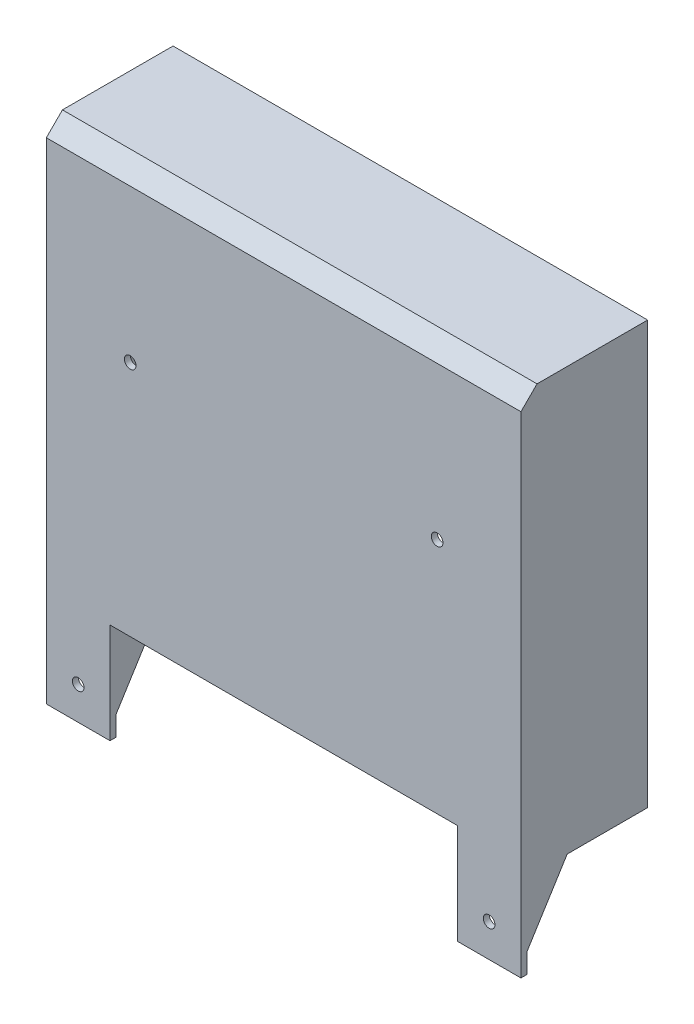
ISO-10303-21;
HEADER;
FILE_DESCRIPTION(('STEP AP214'),'2;1');
FILE_NAME('part.step','',(''),(''),'','','');
FILE_SCHEMA(('AUTOMOTIVE_DESIGN { 1 0 10303 214 1 1 1 1 }'));
ENDSEC;
DATA;
#1=APPLICATION_CONTEXT('core data for automotive mechanical design processes');
#2=APPLICATION_PROTOCOL_DEFINITION('international standard','automotive_design',2000,#1);
#3=PRODUCT_CONTEXT('',#1,'mechanical');
#4=PRODUCT('Part','Part','',(#3));
#5=PRODUCT_RELATED_PRODUCT_CATEGORY('part','',(#4));
#6=PRODUCT_DEFINITION_FORMATION('','',#4);
#7=PRODUCT_DEFINITION_CONTEXT('part definition',#1,'design');
#8=PRODUCT_DEFINITION('design','',#6,#7);
#9=PRODUCT_DEFINITION_SHAPE('','',#8);
#10=(LENGTH_UNIT() NAMED_UNIT(*) SI_UNIT(.MILLI.,.METRE.));
#11=(NAMED_UNIT(*) PLANE_ANGLE_UNIT() SI_UNIT($,.RADIAN.));
#12=(NAMED_UNIT(*) SI_UNIT($,.STERADIAN.) SOLID_ANGLE_UNIT());
#13=UNCERTAINTY_MEASURE_WITH_UNIT(LENGTH_MEASURE(1.E-05),#10,'distance_accuracy_value','');
#14=(GEOMETRIC_REPRESENTATION_CONTEXT(3) GLOBAL_UNCERTAINTY_ASSIGNED_CONTEXT((#13)) GLOBAL_UNIT_ASSIGNED_CONTEXT((#10,
#11,#12)) REPRESENTATION_CONTEXT('',''));
#15=CARTESIAN_POINT('',(0.,0.,0.));
#16=DIRECTION('',(0.,0.,1.));
#17=DIRECTION('',(1.,0.,0.));
#18=AXIS2_PLACEMENT_3D('',#15,#16,#17);
#19=CARTESIAN_POINT('',(2.16535270110808,-14.6366755913293,157.584154046752));
#20=DIRECTION('',(0.,1.,0.));
#21=DIRECTION('',(0.,0.,1.));
#22=AXIS2_PLACEMENT_3D('',#19,#20,#21);
#23=PLANE('',#22);
#24=DIRECTION('',(0.,0.,-1.));
#25=VECTOR('',#24,1.);
#26=CARTESIAN_POINT('',(-0.261795448695042,-14.6366755913293,159.084154046752));
#27=LINE('',#26,#25);
#28=CARTESIAN_POINT('',(-0.261795448695042,-14.6366755913293,155.084154046752));
#29=VERTEX_POINT('',#28);
#30=CARTESIAN_POINT('',(-0.261795448695042,-14.6366755913293,147.584154046752));
#31=VERTEX_POINT('',#30);
#32=EDGE_CURVE('E329',#29,#31,#27,.T.);
#33=ORIENTED_EDGE('',*,*,#32,.F.);
#34=DIRECTION('',(-1.,0.,0.));
#35=VECTOR('',#34,1.);
#36=CARTESIAN_POINT('',(2.16535270110808,-14.6366755913293,155.084154046752));
#37=LINE('',#36,#35);
#38=CARTESIAN_POINT('',(-86.6191496372412,-14.6366755913293,155.084154046752));
#39=VERTEX_POINT('',#38);
#40=EDGE_CURVE('E421',#29,#39,#37,.T.);
#41=ORIENTED_EDGE('',*,*,#40,.T.);
#42=DIRECTION('',(0.,0.,-1.));
#43=VECTOR('',#42,1.);
#44=CARTESIAN_POINT('',(-86.6191496372412,-14.6366755913293,159.084154046752));
#45=LINE('',#44,#43);
#46=CARTESIAN_POINT('',(-86.6191496372412,-14.6366755913293,147.584154046752));
#47=VERTEX_POINT('',#46);
#48=EDGE_CURVE('E302',#39,#47,#45,.T.);
#49=ORIENTED_EDGE('',*,*,#48,.T.);
#50=DIRECTION('',(1.,0.,0.));
#51=VECTOR('',#50,1.);
#52=CARTESIAN_POINT('',(-88.1191496372412,-14.6366755913293,147.584154046752));
#53=LINE('',#52,#51);
#54=CARTESIAN_POINT('',(-88.1191496372412,-14.6366755913293,147.584154046752));
#55=VERTEX_POINT('',#54);
#56=EDGE_CURVE('E276',#55,#47,#53,.T.);
#57=ORIENTED_EDGE('',*,*,#56,.F.);
#58=DIRECTION('',(0.,0.,1.));
#59=VECTOR('',#58,1.);
#60=CARTESIAN_POINT('',(-88.1191496372412,-14.6366755913293,147.584154046752));
#61=LINE('',#60,#59);
#62=CARTESIAN_POINT('',(-88.1191496372412,-14.6366755913293,157.584154046752));
#63=VERTEX_POINT('',#62);
#64=EDGE_CURVE('E266',#55,#63,#61,.T.);
#65=ORIENTED_EDGE('',*,*,#64,.T.);
#66=DIRECTION('',(-1.,0.,0.));
#67=VECTOR('',#66,1.);
#68=CARTESIAN_POINT('',(15.5573783026264,-14.6366755913293,157.584154046752));
#69=LINE('',#68,#67);
#70=CARTESIAN_POINT('',(-100.942621697374,-14.6366755913293,157.584154046752));
#71=VERTEX_POINT('',#70);
#72=EDGE_CURVE('E352',#63,#71,#69,.T.);
#73=ORIENTED_EDGE('',*,*,#72,.T.);
#74=DIRECTION('',(0.,0.,-1.));
#75=VECTOR('',#74,1.);
#76=CARTESIAN_POINT('',(-100.942621697374,-14.6366755913293,159.084154046752));
#77=LINE('',#76,#75);
#78=CARTESIAN_POINT('',(-100.942621697374,-14.6366755913293,147.584154046752));
#79=VERTEX_POINT('',#78);
#80=EDGE_CURVE('E285',#71,#79,#77,.T.);
#81=ORIENTED_EDGE('',*,*,#80,.T.);
#82=DIRECTION('',(-1.,0.,0.));
#83=VECTOR('',#82,1.);
#84=CARTESIAN_POINT('',(-100.942621697374,-14.6366755913293,147.584154046752));
#85=LINE('',#84,#83);
#86=CARTESIAN_POINT('',(-102.442621697374,-14.6366755913293,147.584154046752));
#87=VERTEX_POINT('',#86);
#88=EDGE_CURVE('E291',#79,#87,#85,.T.);
#89=ORIENTED_EDGE('',*,*,#88,.T.);
#90=DIRECTION('',(0.,0.,1.));
#91=VECTOR('',#90,1.);
#92=CARTESIAN_POINT('',(-102.442621697374,-14.6366755913293,137.584154046752));
#93=LINE('',#92,#91);
#94=CARTESIAN_POINT('',(-102.442621697374,-14.6366755913293,127.584154046752));
#95=VERTEX_POINT('',#94);
#96=EDGE_CURVE('E351',#95,#87,#93,.T.);
#97=ORIENTED_EDGE('',*,*,#96,.F.);
#98=DIRECTION('',(-1.,0.,0.));
#99=VECTOR('',#98,1.);
#100=CARTESIAN_POINT('',(15.5573783026264,-14.6366755913293,127.584154046752));
#101=LINE('',#100,#99);
#102=CARTESIAN_POINT('',(15.5573783026264,-14.6366755913293,127.584154046752));
#103=VERTEX_POINT('',#102);
#104=EDGE_CURVE('E249',#103,#95,#101,.T.);
#105=ORIENTED_EDGE('',*,*,#104,.F.);
#106=DIRECTION('',(0.,0.,1.));
#107=VECTOR('',#106,1.);
#108=CARTESIAN_POINT('',(15.5573783026264,-14.6366755913293,137.584154046752));
#109=LINE('',#108,#107);
#110=CARTESIAN_POINT('',(15.5573783026264,-14.6366755913293,147.584154046752));
#111=VERTEX_POINT('',#110);
#112=EDGE_CURVE('E355',#103,#111,#109,.T.);
#113=ORIENTED_EDGE('',*,*,#112,.T.);
#114=DIRECTION('',(1.,0.,0.));
#115=VECTOR('',#114,1.);
#116=CARTESIAN_POINT('',(14.0573783026265,-14.6366755913293,147.584154046752));
#117=LINE('',#116,#115);
#118=CARTESIAN_POINT('',(14.0573783026265,-14.6366755913293,147.584154046752));
#119=VERTEX_POINT('',#118);
#120=EDGE_CURVE('E344',#119,#111,#117,.T.);
#121=ORIENTED_EDGE('',*,*,#120,.F.);
#122=DIRECTION('',(0.,0.,1.));
#123=VECTOR('',#122,1.);
#124=CARTESIAN_POINT('',(14.0573783026265,-14.6366755913293,157.584154046752));
#125=LINE('',#124,#123);
#126=CARTESIAN_POINT('',(14.0573783026265,-14.6366755913293,157.584154046752));
#127=VERTEX_POINT('',#126);
#128=EDGE_CURVE('E334',#119,#127,#125,.T.);
#129=ORIENTED_EDGE('',*,*,#128,.T.);
#130=CARTESIAN_POINT('',(1.23820455130496,-14.6366755913293,157.584154046752));
#131=VERTEX_POINT('',#130);
#132=EDGE_CURVE('E223',#127,#131,#69,.T.);
#133=ORIENTED_EDGE('',*,*,#132,.T.);
#134=DIRECTION('',(0.,0.,-1.));
#135=VECTOR('',#134,1.);
#136=CARTESIAN_POINT('',(1.23820455130496,-14.6366755913293,157.584154046752));
#137=LINE('',#136,#135);
#138=CARTESIAN_POINT('',(1.23820455130496,-14.6366755913293,147.584154046752));
#139=VERTEX_POINT('',#138);
#140=EDGE_CURVE('E311',#131,#139,#137,.T.);
#141=ORIENTED_EDGE('',*,*,#140,.T.);
#142=DIRECTION('',(-1.,0.,0.));
#143=VECTOR('',#142,1.);
#144=CARTESIAN_POINT('',(1.23820455130496,-14.6366755913293,147.584154046752));
#145=LINE('',#144,#143);
#146=EDGE_CURVE('E316',#139,#31,#145,.T.);
#147=ORIENTED_EDGE('',*,*,#146,.T.);
#148=EDGE_LOOP('',(#33,#41,#49,#57,#65,#73,#81,#89,#97,#105,#113,#121,#129,#133,#141,#147));
#149=FACE_BOUND('',#148,.T.);
#150=ADVANCED_FACE('F39',(#149),#23,.F.);
#151=CARTESIAN_POINT('',(0.,0.,157.584154046752));
#152=DIRECTION('',(0.,0.,-1.));
#153=DIRECTION('',(-1.,0.,0.));
#154=AXIS2_PLACEMENT_3D('',#151,#152,#153);
#155=PLANE('',#154);
#156=DIRECTION('',(-1.,0.,0.));
#157=VECTOR('',#156,1.);
#158=CARTESIAN_POINT('',(1.23820455130496,-30.6366755913293,157.584154046752));
#159=LINE('',#158,#157);
#160=CARTESIAN_POINT('',(1.23820455130496,-30.6366755913293,157.584154046752));
#161=VERTEX_POINT('',#160);
#162=CARTESIAN_POINT('',(-0.261795448695044,-30.6366755913293,157.584154046752));
#163=VERTEX_POINT('',#162);
#164=EDGE_CURVE('E319',#161,#163,#159,.T.);
#165=ORIENTED_EDGE('',*,*,#164,.F.);
#166=DIRECTION('',(0.,1.,0.));
#167=VECTOR('',#166,1.);
#168=CARTESIAN_POINT('',(1.23820455130496,-30.6366755913293,157.584154046752));
#169=LINE('',#168,#167);
#170=EDGE_CURVE('E309',#161,#131,#169,.T.);
#171=ORIENTED_EDGE('',*,*,#170,.T.);
#172=ORIENTED_EDGE('',*,*,#132,.F.);
#173=DIRECTION('',(0.,-1.,0.));
#174=VECTOR('',#173,1.);
#175=CARTESIAN_POINT('',(14.0573783026265,-30.6366755913293,157.584154046752));
#176=LINE('',#175,#174);
#177=CARTESIAN_POINT('',(14.0573783026265,-30.6366755913293,157.584154046752));
#178=VERTEX_POINT('',#177);
#179=EDGE_CURVE('E336',#127,#178,#176,.T.);
#180=ORIENTED_EDGE('',*,*,#179,.T.);
#181=DIRECTION('',(1.,0.,0.));
#182=VECTOR('',#181,1.);
#183=CARTESIAN_POINT('',(14.0573783026265,-30.6366755913293,157.584154046752));
#184=LINE('',#183,#182);
#185=CARTESIAN_POINT('',(15.5573783026265,-30.6366755913293,157.584154046752));
#186=VERTEX_POINT('',#185);
#187=EDGE_CURVE('E341',#178,#186,#184,.T.);
#188=ORIENTED_EDGE('',*,*,#187,.T.);
#189=DIRECTION('',(0.,-1.,0.));
#190=VECTOR('',#189,1.);
#191=CARTESIAN_POINT('',(15.5573783026264,75.3633244086707,157.584154046752));
#192=LINE('',#191,#190);
#193=CARTESIAN_POINT('',(15.5573783026265,-35.5678261367254,157.584154046752));
#194=VERTEX_POINT('',#193);
#195=EDGE_CURVE('E382',#186,#194,#192,.T.);
#196=ORIENTED_EDGE('',*,*,#195,.T.);
#197=DIRECTION('',(-1.,0.,0.));
#198=VECTOR('',#197,1.);
#199=CARTESIAN_POINT('',(15.5573783026265,-35.5678261367254,157.584154046752));
#200=LINE('',#199,#198);
#201=CARTESIAN_POINT('',(-0.261795448695044,-35.5678261367254,157.584154046752));
#202=VERTEX_POINT('',#201);
#203=EDGE_CURVE('E384',#194,#202,#200,.T.);
#204=ORIENTED_EDGE('',*,*,#203,.T.);
#205=DIRECTION('',(0.,1.,0.));
#206=VECTOR('',#205,1.);
#207=CARTESIAN_POINT('',(-0.261795448695042,-14.6366755913293,157.584154046752));
#208=LINE('',#207,#206);
#209=EDGE_CURVE('E322',#202,#163,#208,.T.);
#210=ORIENTED_EDGE('',*,*,#209,.T.);
#211=EDGE_LOOP('',(#165,#171,#172,#180,#188,#196,#204,#210));
#212=FACE_BOUND('',#211,.T.);
#213=CARTESIAN_POINT('',(7.64820455130496,-27.3724616697869,157.584154046752));
#214=DIRECTION('',(0.,0.,-1.));
#215=DIRECTION('',(-1.,0.,0.));
#216=AXIS2_PLACEMENT_3D('',#213,#214,#215);
#217=CIRCLE('',#216,1.4425);
#218=CARTESIAN_POINT('',(6.20570455130496,-27.3724616697869,157.584154046752));
#219=VERTEX_POINT('',#218);
#220=EDGE_CURVE('E376',#219,#219,#217,.T.);
#221=ORIENTED_EDGE('',*,*,#220,.F.);
#222=EDGE_LOOP('',(#221));
#223=FACE_BOUND('',#222,.T.);
#224=ADVANCED_FACE('F490',(#212,#223),#155,.T.);
#225=DIRECTION('',(-1.,0.,0.));
#226=VECTOR('',#225,1.);
#227=CARTESIAN_POINT('',(-101.042621697374,-9.2366755913294,157.584154046752));
#228=LINE('',#227,#226);
#229=CARTESIAN_POINT('',(10.1573783026265,-9.2366755913294,157.584154046752));
#230=VERTEX_POINT('',#229);
#231=CARTESIAN_POINT('',(-97.0426216973736,-9.2366755913294,157.584154046752));
#232=VERTEX_POINT('',#231);
#233=EDGE_CURVE('E408',#230,#232,#228,.T.);
#234=ORIENTED_EDGE('',*,*,#233,.T.);
#235=DIRECTION('',(0.,1.,0.));
#236=VECTOR('',#235,1.);
#237=CARTESIAN_POINT('',(-97.0426216973736,88.9633244086707,157.584154046752));
#238=LINE('',#237,#236);
#239=CARTESIAN_POINT('',(-97.0426216973736,84.9633244086707,157.584154046752));
#240=VERTEX_POINT('',#239);
#241=EDGE_CURVE('E410',#232,#240,#238,.T.);
#242=ORIENTED_EDGE('',*,*,#241,.T.);
#243=DIRECTION('',(1.,0.,0.));
#244=VECTOR('',#243,1.);
#245=CARTESIAN_POINT('',(0.,84.9633244086707,157.584154046752));
#246=LINE('',#245,#244);
#247=CARTESIAN_POINT('',(10.1573783026265,84.9633244086707,157.584154046752));
#248=VERTEX_POINT('',#247);
#249=EDGE_CURVE('E404',#240,#248,#246,.T.);
#250=ORIENTED_EDGE('',*,*,#249,.T.);
#251=DIRECTION('',(0.,-1.,0.));
#252=VECTOR('',#251,1.);
#253=CARTESIAN_POINT('',(10.1573783026265,-13.2366755913293,157.584154046752));
#254=LINE('',#253,#252);
#255=EDGE_CURVE('E406',#248,#230,#254,.T.);
#256=ORIENTED_EDGE('',*,*,#255,.T.);
#257=EDGE_LOOP('',(#234,#242,#250,#256));
#258=FACE_BOUND('',#257,.T.);
#259=CARTESIAN_POINT('',(-81.5963626285966,48.4068487033275,157.584154046752));
#260=DIRECTION('',(0.,0.,-1.));
#261=DIRECTION('',(-1.,0.,0.));
#262=AXIS2_PLACEMENT_3D('',#259,#260,#261);
#263=CIRCLE('',#262,1.45);
#264=CARTESIAN_POINT('',(-83.0463626285966,48.4068487033275,157.584154046752));
#265=VERTEX_POINT('',#264);
#266=EDGE_CURVE('E358',#265,#265,#263,.T.);
#267=ORIENTED_EDGE('',*,*,#266,.F.);
#268=EDGE_LOOP('',(#267));
#269=FACE_BOUND('',#268,.T.);
#270=CARTESIAN_POINT('',(-5.2845824573397,48.4068487033275,157.584154046752));
#271=DIRECTION('',(0.,0.,-1.));
#272=DIRECTION('',(-1.,0.,0.));
#273=AXIS2_PLACEMENT_3D('',#270,#271,#272);
#274=CIRCLE('',#273,1.45);
#275=CARTESIAN_POINT('',(-6.7345824573397,48.4068487033275,157.584154046752));
#276=VERTEX_POINT('',#275);
#277=EDGE_CURVE('E364',#276,#276,#274,.T.);
#278=ORIENTED_EDGE('',*,*,#277,.F.);
#279=EDGE_LOOP('',(#278));
#280=FACE_BOUND('',#279,.T.);
#281=ADVANCED_FACE('F497',(#258,#269,#280),#155,.T.);
#282=DIRECTION('',(1.,0.,0.));
#283=VECTOR('',#282,1.);
#284=CARTESIAN_POINT('',(-88.1191496372412,-30.6366755913293,157.584154046752));
#285=LINE('',#284,#283);
#286=CARTESIAN_POINT('',(-88.1191496372412,-30.6366755913293,157.584154046752));
#287=VERTEX_POINT('',#286);
#288=CARTESIAN_POINT('',(-86.6191496372412,-30.6366755913293,157.584154046752));
#289=VERTEX_POINT('',#288);
#290=EDGE_CURVE('E273',#287,#289,#285,.T.);
#291=ORIENTED_EDGE('',*,*,#290,.T.);
#292=DIRECTION('',(0.,-1.,0.));
#293=VECTOR('',#292,1.);
#294=CARTESIAN_POINT('',(-86.6191496372412,-35.5678261367254,157.584154046752));
#295=LINE('',#294,#293);
#296=CARTESIAN_POINT('',(-86.6191496372412,-35.5678261367254,157.584154046752));
#297=VERTEX_POINT('',#296);
#298=EDGE_CURVE('E298',#289,#297,#295,.T.);
#299=ORIENTED_EDGE('',*,*,#298,.T.);
#300=DIRECTION('',(-1.,0.,0.));
#301=VECTOR('',#300,1.);
#302=CARTESIAN_POINT('',(-102.442621697374,-35.5678261367254,157.584154046752));
#303=LINE('',#302,#301);
#304=CARTESIAN_POINT('',(-102.442621697374,-35.5678261367254,157.584154046752));
#305=VERTEX_POINT('',#304);
#306=EDGE_CURVE('E387',#297,#305,#303,.T.);
#307=ORIENTED_EDGE('',*,*,#306,.T.);
#308=DIRECTION('',(0.,1.,0.));
#309=VECTOR('',#308,1.);
#310=CARTESIAN_POINT('',(-102.442621697374,-14.6366755913293,157.584154046752));
#311=LINE('',#310,#309);
#312=CARTESIAN_POINT('',(-102.442621697374,-30.6366755913293,157.584154046752));
#313=VERTEX_POINT('',#312);
#314=EDGE_CURVE('E389',#305,#313,#311,.T.);
#315=ORIENTED_EDGE('',*,*,#314,.T.);
#316=DIRECTION('',(-1.,0.,0.));
#317=VECTOR('',#316,1.);
#318=CARTESIAN_POINT('',(-100.942621697374,-30.6366755913293,157.584154046752));
#319=LINE('',#318,#317);
#320=CARTESIAN_POINT('',(-100.942621697374,-30.6366755913293,157.584154046752));
#321=VERTEX_POINT('',#320);
#322=EDGE_CURVE('E288',#321,#313,#319,.T.);
#323=ORIENTED_EDGE('',*,*,#322,.F.);
#324=DIRECTION('',(0.,1.,0.));
#325=VECTOR('',#324,1.);
#326=CARTESIAN_POINT('',(-100.942621697374,0.,157.584154046752));
#327=LINE('',#326,#325);
#328=EDGE_CURVE('E294',#321,#71,#327,.T.);
#329=ORIENTED_EDGE('',*,*,#328,.T.);
#330=ORIENTED_EDGE('',*,*,#72,.F.);
#331=DIRECTION('',(0.,-1.,0.));
#332=VECTOR('',#331,1.);
#333=CARTESIAN_POINT('',(-88.1191496372412,-14.6366755913293,157.584154046752));
#334=LINE('',#333,#332);
#335=EDGE_CURVE('E268',#63,#287,#334,.T.);
#336=ORIENTED_EDGE('',*,*,#335,.T.);
#337=EDGE_LOOP('',(#291,#299,#307,#315,#323,#329,#330,#336));
#338=FACE_BOUND('',#337,.T.);
#339=CARTESIAN_POINT('',(-94.5291496372412,-27.3724616697869,157.584154046752));
#340=DIRECTION('',(0.,0.,-1.));
#341=DIRECTION('',(-1.,0.,0.));
#342=AXIS2_PLACEMENT_3D('',#339,#340,#341);
#343=CIRCLE('',#342,1.4425);
#344=CARTESIAN_POINT('',(-95.9716496372412,-27.3724616697869,157.584154046752));
#345=VERTEX_POINT('',#344);
#346=EDGE_CURVE('E370',#345,#345,#343,.T.);
#347=ORIENTED_EDGE('',*,*,#346,.F.);
#348=EDGE_LOOP('',(#347));
#349=FACE_BOUND('',#348,.T.);
#350=ADVANCED_FACE('F464',(#338,#349),#155,.T.);
#351=CARTESIAN_POINT('',(0.,0.,159.084154046752));
#352=DIRECTION('',(0.,0.,-1.));
#353=DIRECTION('',(-1.,0.,0.));
#354=AXIS2_PLACEMENT_3D('',#351,#352,#353);
#355=PLANE('',#354);
#356=DIRECTION('',(0.,-1.,0.));
#357=VECTOR('',#356,1.);
#358=CARTESIAN_POINT('',(-86.6191496372412,-35.5678261367254,159.084154046752));
#359=LINE('',#358,#357);
#360=CARTESIAN_POINT('',(-86.6191496372412,-10.6366755913293,159.084154046752));
#361=VERTEX_POINT('',#360);
#362=CARTESIAN_POINT('',(-86.6191496372412,-35.5678261367254,159.084154046752));
#363=VERTEX_POINT('',#362);
#364=EDGE_CURVE('E299',#361,#363,#359,.T.);
#365=ORIENTED_EDGE('',*,*,#364,.F.);
#366=DIRECTION('',(1.,0.,0.));
#367=VECTOR('',#366,1.);
#368=CARTESIAN_POINT('',(0.,-10.6366755913293,159.084154046752));
#369=LINE('',#368,#367);
#370=CARTESIAN_POINT('',(-0.261795448695041,-10.6366755913293,159.084154046752));
#371=VERTEX_POINT('',#370);
#372=EDGE_CURVE('E435',#361,#371,#369,.T.);
#373=ORIENTED_EDGE('',*,*,#372,.T.);
#374=DIRECTION('',(0.,1.,0.));
#375=VECTOR('',#374,1.);
#376=CARTESIAN_POINT('',(-0.261795448695042,-14.6366755913293,159.084154046752));
#377=LINE('',#376,#375);
#378=CARTESIAN_POINT('',(-0.261795448695044,-35.5678261367254,159.084154046752));
#379=VERTEX_POINT('',#378);
#380=EDGE_CURVE('E325',#379,#371,#377,.T.);
#381=ORIENTED_EDGE('',*,*,#380,.F.);
#382=DIRECTION('',(-1.,0.,0.));
#383=VECTOR('',#382,1.);
#384=CARTESIAN_POINT('',(15.5573783026265,-35.5678261367254,159.084154046752));
#385=LINE('',#384,#383);
#386=CARTESIAN_POINT('',(15.5573783026265,-35.5678261367254,159.084154046752));
#387=VERTEX_POINT('',#386);
#388=EDGE_CURVE('E394',#387,#379,#385,.T.);
#389=ORIENTED_EDGE('',*,*,#388,.F.);
#390=DIRECTION('',(0.,-1.,0.));
#391=VECTOR('',#390,1.);
#392=CARTESIAN_POINT('',(15.5573783026265,-14.6366755913293,159.084154046752));
#393=LINE('',#392,#391);
#394=CARTESIAN_POINT('',(15.5573783026265,86.3633244086707,159.084154046752));
#395=VERTEX_POINT('',#394);
#396=EDGE_CURVE('E379',#395,#387,#393,.T.);
#397=ORIENTED_EDGE('',*,*,#396,.F.);
#398=DIRECTION('',(-1.,0.,0.));
#399=VECTOR('',#398,1.);
#400=CARTESIAN_POINT('',(0.,86.3633244086707,159.084154046752));
#401=LINE('',#400,#399);
#402=CARTESIAN_POINT('',(-102.442621697373,86.3633244086707,159.084154046752));
#403=VERTEX_POINT('',#402);
#404=EDGE_CURVE('E432',#395,#403,#401,.T.);
#405=ORIENTED_EDGE('',*,*,#404,.T.);
#406=DIRECTION('',(0.,1.,0.));
#407=VECTOR('',#406,1.);
#408=CARTESIAN_POINT('',(-102.442621697373,75.3633244086707,159.084154046752));
#409=LINE('',#408,#407);
#410=CARTESIAN_POINT('',(-102.442621697374,-35.5678261367254,159.084154046752));
#411=VERTEX_POINT('',#410);
#412=EDGE_CURVE('E385',#411,#403,#409,.T.);
#413=ORIENTED_EDGE('',*,*,#412,.F.);
#414=DIRECTION('',(-1.,0.,0.));
#415=VECTOR('',#414,1.);
#416=CARTESIAN_POINT('',(-102.442621697374,-35.5678261367254,159.084154046752));
#417=LINE('',#416,#415);
#418=EDGE_CURVE('E396',#363,#411,#417,.T.);
#419=ORIENTED_EDGE('',*,*,#418,.F.);
#420=EDGE_LOOP('',(#365,#373,#381,#389,#397,#405,#413,#419));
#421=FACE_BOUND('',#420,.T.);
#422=CARTESIAN_POINT('',(7.64820455130496,-27.3724616697869,159.084154046752));
#423=DIRECTION('',(0.,0.,-1.));
#424=DIRECTION('',(-1.,0.,0.));
#425=AXIS2_PLACEMENT_3D('',#422,#423,#424);
#426=CIRCLE('',#425,1.4425);
#427=CARTESIAN_POINT('',(6.20570455130496,-27.3724616697869,159.084154046752));
#428=VERTEX_POINT('',#427);
#429=EDGE_CURVE('E373',#428,#428,#426,.T.);
#430=ORIENTED_EDGE('',*,*,#429,.T.);
#431=EDGE_LOOP('',(#430));
#432=FACE_BOUND('',#431,.T.);
#433=CARTESIAN_POINT('',(-94.5291496372412,-27.3724616697869,159.084154046752));
#434=DIRECTION('',(0.,0.,-1.));
#435=DIRECTION('',(-1.,0.,0.));
#436=AXIS2_PLACEMENT_3D('',#433,#434,#435);
#437=CIRCLE('',#436,1.4425);
#438=CARTESIAN_POINT('',(-95.9716496372412,-27.3724616697869,159.084154046752));
#439=VERTEX_POINT('',#438);
#440=EDGE_CURVE('E367',#439,#439,#437,.T.);
#441=ORIENTED_EDGE('',*,*,#440,.T.);
#442=EDGE_LOOP('',(#441));
#443=FACE_BOUND('',#442,.T.);
#444=CARTESIAN_POINT('',(-5.2845824573397,48.4068487033275,159.084154046752));
#445=DIRECTION('',(0.,0.,-1.));
#446=DIRECTION('',(-1.,0.,0.));
#447=AXIS2_PLACEMENT_3D('',#444,#445,#446);
#448=CIRCLE('',#447,1.45);
#449=CARTESIAN_POINT('',(-6.7345824573397,48.4068487033275,159.084154046752));
#450=VERTEX_POINT('',#449);
#451=EDGE_CURVE('E361',#450,#450,#448,.T.);
#452=ORIENTED_EDGE('',*,*,#451,.T.);
#453=EDGE_LOOP('',(#452));
#454=FACE_BOUND('',#453,.T.);
#455=CARTESIAN_POINT('',(-81.5963626285966,48.4068487033275,159.084154046752));
#456=DIRECTION('',(0.,0.,-1.));
#457=DIRECTION('',(-1.,0.,0.));
#458=AXIS2_PLACEMENT_3D('',#455,#456,#457);
#459=CIRCLE('',#458,1.45);
#460=CARTESIAN_POINT('',(-83.0463626285966,48.4068487033275,159.084154046752));
#461=VERTEX_POINT('',#460);
#462=EDGE_CURVE('E357',#461,#461,#459,.T.);
#463=ORIENTED_EDGE('',*,*,#462,.T.);
#464=EDGE_LOOP('',(#463));
#465=FACE_BOUND('',#464,.T.);
#466=ADVANCED_FACE('F452',(#421,#432,#443,#454,#465),#355,.F.);
#467=CARTESIAN_POINT('',(15.5573783026265,-14.6366755913293,157.584154046752));
#468=DIRECTION('',(-1.,0.,0.));
#469=DIRECTION('',(0.,0.,1.));
#470=AXIS2_PLACEMENT_3D('',#467,#468,#469);
#471=PLANE('',#470);
#472=DIRECTION('',(0.,0.,1.));
#473=VECTOR('',#472,1.);
#474=CARTESIAN_POINT('',(15.5573783026264,90.3633244086707,137.584154046752));
#475=LINE('',#474,#473);
#476=CARTESIAN_POINT('',(15.5573783026264,90.3633244086707,127.584154046752));
#477=VERTEX_POINT('',#476);
#478=CARTESIAN_POINT('',(15.5573783026264,90.3633244086707,155.084154046752));
#479=VERTEX_POINT('',#478);
#480=EDGE_CURVE('E256',#477,#479,#475,.T.);
#481=ORIENTED_EDGE('',*,*,#480,.T.);
#482=DIRECTION('',(0.,0.707106781186546,-0.707106781186549));
#483=VECTOR('',#482,1.);
#484=CARTESIAN_POINT('',(15.5573783026265,86.3633244086707,159.084154046752));
#485=LINE('',#484,#483);
#486=EDGE_CURVE('E440',#479,#395,#485,.F.);
#487=ORIENTED_EDGE('',*,*,#486,.T.);
#488=ORIENTED_EDGE('',*,*,#396,.T.);
#489=DIRECTION('',(0.,0.,1.));
#490=VECTOR('',#489,1.);
#491=CARTESIAN_POINT('',(15.5573783026265,-35.5678261367254,157.584154046752));
#492=LINE('',#491,#490);
#493=EDGE_CURVE('E401',#194,#387,#492,.T.);
#494=ORIENTED_EDGE('',*,*,#493,.F.);
#495=ORIENTED_EDGE('',*,*,#195,.F.);
#496=DIRECTION('',(0.,0.847998304005088,-0.52999894000318));
#497=VECTOR('',#496,1.);
#498=CARTESIAN_POINT('',(15.5573783026265,-14.6366755913293,147.584154046752));
#499=LINE('',#498,#497);
#500=EDGE_CURVE('E331',#186,#111,#499,.T.);
#501=ORIENTED_EDGE('',*,*,#500,.T.);
#502=ORIENTED_EDGE('',*,*,#112,.F.);
#503=DIRECTION('',(0.,-1.,0.));
#504=VECTOR('',#503,1.);
#505=CARTESIAN_POINT('',(15.5573783026264,90.3633244086707,127.584154046752));
#506=LINE('',#505,#504);
#507=EDGE_CURVE('E246',#477,#103,#506,.T.);
#508=ORIENTED_EDGE('',*,*,#507,.F.);
#509=EDGE_LOOP('',(#481,#487,#488,#494,#495,#501,#502,#508));
#510=FACE_BOUND('',#509,.T.);
#511=ADVANCED_FACE('F506',(#510),#471,.F.);
#512=CARTESIAN_POINT('',(15.5573783026265,-35.5678261367254,157.584154046752));
#513=DIRECTION('',(0.,1.,0.));
#514=DIRECTION('',(0.,0.,1.));
#515=AXIS2_PLACEMENT_3D('',#512,#513,#514);
#516=PLANE('',#515);
#517=ORIENTED_EDGE('',*,*,#388,.T.);
#518=DIRECTION('',(0.,0.,-1.));
#519=VECTOR('',#518,1.);
#520=CARTESIAN_POINT('',(-0.261795448695044,-35.5678261367254,159.084154046752));
#521=LINE('',#520,#519);
#522=EDGE_CURVE('E327',#379,#202,#521,.T.);
#523=ORIENTED_EDGE('',*,*,#522,.T.);
#524=ORIENTED_EDGE('',*,*,#203,.F.);
#525=ORIENTED_EDGE('',*,*,#493,.T.);
#526=EDGE_LOOP('',(#517,#523,#524,#525));
#527=FACE_BOUND('',#526,.T.);
#528=ADVANCED_FACE('F503',(#527),#516,.F.);
#529=CARTESIAN_POINT('',(-102.442621697374,-35.5678261367254,157.584154046752));
#530=DIRECTION('',(0.,1.,0.));
#531=DIRECTION('',(0.,0.,1.));
#532=AXIS2_PLACEMENT_3D('',#529,#530,#531);
#533=PLANE('',#532);
#534=DIRECTION('',(0.,0.,1.));
#535=VECTOR('',#534,1.);
#536=CARTESIAN_POINT('',(-102.442621697374,-35.5678261367254,157.584154046752));
#537=LINE('',#536,#535);
#538=EDGE_CURVE('E392',#305,#411,#537,.T.);
#539=ORIENTED_EDGE('',*,*,#538,.F.);
#540=ORIENTED_EDGE('',*,*,#306,.F.);
#541=DIRECTION('',(0.,0.,-1.));
#542=VECTOR('',#541,1.);
#543=CARTESIAN_POINT('',(-86.6191496372412,-35.5678261367254,159.084154046752));
#544=LINE('',#543,#542);
#545=EDGE_CURVE('E304',#363,#297,#544,.T.);
#546=ORIENTED_EDGE('',*,*,#545,.F.);
#547=ORIENTED_EDGE('',*,*,#418,.T.);
#548=EDGE_LOOP('',(#539,#540,#546,#547));
#549=FACE_BOUND('',#548,.T.);
#550=ADVANCED_FACE('F460',(#549),#533,.F.);
#551=CARTESIAN_POINT('',(-102.442621697373,75.3633244086707,157.584154046752));
#552=DIRECTION('',(1.,0.,0.));
#553=DIRECTION('',(0.,1.,0.));
#554=AXIS2_PLACEMENT_3D('',#551,#552,#553);
#555=PLANE('',#554);
#556=ORIENTED_EDGE('',*,*,#412,.T.);
#557=DIRECTION('',(0.,-0.707106781186546,0.707106781186549));
#558=VECTOR('',#557,1.);
#559=CARTESIAN_POINT('',(-102.442621697373,86.3633244086707,159.084154046752));
#560=LINE('',#559,#558);
#561=CARTESIAN_POINT('',(-102.442621697374,90.3633244086707,155.084154046752));
#562=VERTEX_POINT('',#561);
#563=EDGE_CURVE('E63',#403,#562,#560,.F.);
#564=ORIENTED_EDGE('',*,*,#563,.T.);
#565=DIRECTION('',(0.,0.,1.));
#566=VECTOR('',#565,1.);
#567=CARTESIAN_POINT('',(-102.442621697374,90.3633244086707,137.584154046752));
#568=LINE('',#567,#566);
#569=CARTESIAN_POINT('',(-102.442621697374,90.3633244086707,127.584154046752));
#570=VERTEX_POINT('',#569);
#571=EDGE_CURVE('E258',#570,#562,#568,.T.);
#572=ORIENTED_EDGE('',*,*,#571,.F.);
#573=DIRECTION('',(0.,1.,0.));
#574=VECTOR('',#573,1.);
#575=CARTESIAN_POINT('',(-102.442621697374,-14.6366755913293,127.584154046752));
#576=LINE('',#575,#574);
#577=EDGE_CURVE('E252',#95,#570,#576,.T.);
#578=ORIENTED_EDGE('',*,*,#577,.F.);
#579=ORIENTED_EDGE('',*,*,#96,.T.);
#580=DIRECTION('',(0.,-0.847998304005088,0.52999894000318));
#581=VECTOR('',#580,1.);
#582=CARTESIAN_POINT('',(-102.442621697374,-14.6366755913293,147.584154046752));
#583=LINE('',#582,#581);
#584=EDGE_CURVE('E279',#87,#313,#583,.T.);
#585=ORIENTED_EDGE('',*,*,#584,.T.);
#586=ORIENTED_EDGE('',*,*,#314,.F.);
#587=ORIENTED_EDGE('',*,*,#538,.T.);
#588=EDGE_LOOP('',(#556,#564,#572,#578,#579,#585,#586,#587));
#589=FACE_BOUND('',#588,.T.);
#590=ADVANCED_FACE('F583',(#589),#555,.F.);
#591=CARTESIAN_POINT('',(7.64820455130496,-27.3724616697869,157.584154046752));
#592=DIRECTION('',(0.,0.,1.));
#593=DIRECTION('',(1.,0.,0.));
#594=AXIS2_PLACEMENT_3D('',#591,#592,#593);
#595=CYLINDRICAL_SURFACE('',#594,1.4425);
#596=ORIENTED_EDGE('',*,*,#220,.T.);
#597=EDGE_LOOP('',(#596));
#598=FACE_BOUND('',#597,.T.);
#599=ORIENTED_EDGE('',*,*,#429,.F.);
#600=EDGE_LOOP('',(#599));
#601=FACE_BOUND('',#600,.T.);
#602=ADVANCED_FACE('F660',(#598,#601),#595,.F.);
#603=CARTESIAN_POINT('',(-94.5291496372412,-27.3724616697869,157.584154046752));
#604=DIRECTION('',(0.,0.,1.));
#605=DIRECTION('',(1.,0.,0.));
#606=AXIS2_PLACEMENT_3D('',#603,#604,#605);
#607=CYLINDRICAL_SURFACE('',#606,1.4425);
#608=ORIENTED_EDGE('',*,*,#346,.T.);
#609=EDGE_LOOP('',(#608));
#610=FACE_BOUND('',#609,.T.);
#611=ORIENTED_EDGE('',*,*,#440,.F.);
#612=EDGE_LOOP('',(#611));
#613=FACE_BOUND('',#612,.T.);
#614=ADVANCED_FACE('F807',(#610,#613),#607,.F.);
#615=CARTESIAN_POINT('',(-5.2845824573397,48.4068487033275,157.584154046752));
#616=DIRECTION('',(0.,0.,1.));
#617=DIRECTION('',(1.,0.,0.));
#618=AXIS2_PLACEMENT_3D('',#615,#616,#617);
#619=CYLINDRICAL_SURFACE('',#618,1.45);
#620=ORIENTED_EDGE('',*,*,#277,.T.);
#621=EDGE_LOOP('',(#620));
#622=FACE_BOUND('',#621,.T.);
#623=ORIENTED_EDGE('',*,*,#451,.F.);
#624=EDGE_LOOP('',(#623));
#625=FACE_BOUND('',#624,.T.);
#626=ADVANCED_FACE('F814',(#622,#625),#619,.F.);
#627=CARTESIAN_POINT('',(-81.5963626285966,48.4068487033275,157.584154046752));
#628=DIRECTION('',(0.,0.,1.));
#629=DIRECTION('',(1.,0.,0.));
#630=AXIS2_PLACEMENT_3D('',#627,#628,#629);
#631=CYLINDRICAL_SURFACE('',#630,1.45);
#632=ORIENTED_EDGE('',*,*,#266,.T.);
#633=EDGE_LOOP('',(#632));
#634=FACE_BOUND('',#633,.T.);
#635=ORIENTED_EDGE('',*,*,#462,.F.);
#636=EDGE_LOOP('',(#635));
#637=FACE_BOUND('',#636,.T.);
#638=ADVANCED_FACE('F648',(#634,#637),#631,.F.);
#639=CARTESIAN_POINT('',(14.1573783026264,73.9633244086707,137.584154046752));
#640=DIRECTION('',(-1.,0.,0.));
#641=DIRECTION('',(0.,0.,1.));
#642=AXIS2_PLACEMENT_3D('',#639,#640,#641);
#643=PLANE('',#642);
#644=DIRECTION('',(0.,0.,1.));
#645=VECTOR('',#644,1.);
#646=CARTESIAN_POINT('',(14.1573783026264,-13.2366755913293,137.584154046752));
#647=LINE('',#646,#645);
#648=CARTESIAN_POINT('',(14.1573783026264,-13.2366755913293,127.584154046752));
#649=VERTEX_POINT('',#648);
#650=CARTESIAN_POINT('',(14.1573783026264,-13.2366755913293,153.584154046752));
#651=VERTEX_POINT('',#650);
#652=EDGE_CURVE('E212',#649,#651,#647,.T.);
#653=ORIENTED_EDGE('',*,*,#652,.T.);
#654=DIRECTION('',(0.,1.,0.));
#655=VECTOR('',#654,1.);
#656=CARTESIAN_POINT('',(14.1573783026264,88.9633244086707,153.584154046752));
#657=LINE('',#656,#655);
#658=CARTESIAN_POINT('',(14.1573783026264,88.9633244086707,153.584154046752));
#659=VERTEX_POINT('',#658);
#660=EDGE_CURVE('E417',#651,#659,#657,.T.);
#661=ORIENTED_EDGE('',*,*,#660,.T.);
#662=DIRECTION('',(0.,0.,1.));
#663=VECTOR('',#662,1.);
#664=CARTESIAN_POINT('',(14.1573783026264,88.9633244086707,137.584154046752));
#665=LINE('',#664,#663);
#666=CARTESIAN_POINT('',(14.1573783026264,88.9633244086707,127.584154046752));
#667=VERTEX_POINT('',#666);
#668=EDGE_CURVE('E230',#667,#659,#665,.T.);
#669=ORIENTED_EDGE('',*,*,#668,.F.);
#670=DIRECTION('',(0.,-1.,0.));
#671=VECTOR('',#670,1.);
#672=CARTESIAN_POINT('',(14.1573783026264,88.9633244086707,127.584154046752));
#673=LINE('',#672,#671);
#674=EDGE_CURVE('E227',#667,#649,#673,.T.);
#675=ORIENTED_EDGE('',*,*,#674,.T.);
#676=EDGE_LOOP('',(#653,#661,#669,#675));
#677=FACE_BOUND('',#676,.T.);
#678=ADVANCED_FACE('F228',(#677),#643,.T.);
#679=CARTESIAN_POINT('',(14.1573783026264,-13.2366755913293,137.584154046752));
#680=DIRECTION('',(0.,1.,0.));
#681=DIRECTION('',(-1.,0.,0.));
#682=AXIS2_PLACEMENT_3D('',#679,#680,#681);
#683=PLANE('',#682);
#684=DIRECTION('',(0.,0.,1.));
#685=VECTOR('',#684,1.);
#686=CARTESIAN_POINT('',(-101.042621697374,-13.2366755913293,137.584154046752));
#687=LINE('',#686,#685);
#688=CARTESIAN_POINT('',(-101.042621697374,-13.2366755913293,127.584154046752));
#689=VERTEX_POINT('',#688);
#690=CARTESIAN_POINT('',(-101.042621697374,-13.2366755913293,153.584154046752));
#691=VERTEX_POINT('',#690);
#692=EDGE_CURVE('E224',#689,#691,#687,.T.);
#693=ORIENTED_EDGE('',*,*,#692,.T.);
#694=DIRECTION('',(1.,0.,0.));
#695=VECTOR('',#694,1.);
#696=CARTESIAN_POINT('',(14.1573783026264,-13.2366755913293,153.584154046752));
#697=LINE('',#696,#695);
#698=EDGE_CURVE('E220',#691,#651,#697,.T.);
#699=ORIENTED_EDGE('',*,*,#698,.T.);
#700=ORIENTED_EDGE('',*,*,#652,.F.);
#701=DIRECTION('',(-1.,0.,0.));
#702=VECTOR('',#701,1.);
#703=CARTESIAN_POINT('',(14.1573783026264,-13.2366755913293,127.584154046752));
#704=LINE('',#703,#702);
#705=EDGE_CURVE('E217',#649,#689,#704,.T.);
#706=ORIENTED_EDGE('',*,*,#705,.T.);
#707=EDGE_LOOP('',(#693,#699,#700,#706));
#708=FACE_BOUND('',#707,.T.);
#709=ADVANCED_FACE('F215',(#708),#683,.T.);
#710=CARTESIAN_POINT('',(-101.042621697374,73.9633244086707,137.584154046752));
#711=DIRECTION('',(1.,0.,0.));
#712=DIRECTION('',(0.,0.,-1.));
#713=AXIS2_PLACEMENT_3D('',#710,#711,#712);
#714=PLANE('',#713);
#715=DIRECTION('',(0.,0.,1.));
#716=VECTOR('',#715,1.);
#717=CARTESIAN_POINT('',(-101.042621697374,88.9633244086707,137.584154046752));
#718=LINE('',#717,#716);
#719=CARTESIAN_POINT('',(-101.042621697374,88.9633244086707,127.584154046752));
#720=VERTEX_POINT('',#719);
#721=CARTESIAN_POINT('',(-101.042621697374,88.9633244086707,153.584154046752));
#722=VERTEX_POINT('',#721);
#723=EDGE_CURVE('E261',#720,#722,#718,.T.);
#724=ORIENTED_EDGE('',*,*,#723,.T.);
#725=DIRECTION('',(0.,-1.,0.));
#726=VECTOR('',#725,1.);
#727=CARTESIAN_POINT('',(-101.042621697374,-13.2366755913293,153.584154046752));
#728=LINE('',#727,#726);
#729=EDGE_CURVE('E413',#722,#691,#728,.T.);
#730=ORIENTED_EDGE('',*,*,#729,.T.);
#731=ORIENTED_EDGE('',*,*,#692,.F.);
#732=DIRECTION('',(0.,1.,0.));
#733=VECTOR('',#732,1.);
#734=CARTESIAN_POINT('',(-101.042621697374,88.9633244086707,127.584154046752));
#735=LINE('',#734,#733);
#736=EDGE_CURVE('E237',#689,#720,#735,.T.);
#737=ORIENTED_EDGE('',*,*,#736,.T.);
#738=EDGE_LOOP('',(#724,#730,#731,#737));
#739=FACE_BOUND('',#738,.T.);
#740=ADVANCED_FACE('F618',(#739),#714,.T.);
#741=CARTESIAN_POINT('',(14.0573783026265,-14.6366755913293,147.584154046752));
#742=DIRECTION('',(0.,-0.529998940003179,-0.847998304005088));
#743=DIRECTION('',(0.,0.847998304005088,-0.52999894000318));
#744=AXIS2_PLACEMENT_3D('',#741,#742,#743);
#745=PLANE('',#744);
#746=ORIENTED_EDGE('',*,*,#500,.F.);
#747=ORIENTED_EDGE('',*,*,#187,.F.);
#748=DIRECTION('',(0.,0.847998304005088,-0.52999894000318));
#749=VECTOR('',#748,1.);
#750=CARTESIAN_POINT('',(14.0573783026265,-14.6366755913293,147.584154046752));
#751=LINE('',#750,#749);
#752=EDGE_CURVE('E338',#178,#119,#751,.T.);
#753=ORIENTED_EDGE('',*,*,#752,.T.);
#754=ORIENTED_EDGE('',*,*,#120,.T.);
#755=EDGE_LOOP('',(#746,#747,#753,#754));
#756=FACE_BOUND('',#755,.T.);
#757=ADVANCED_FACE('F578',(#756),#745,.T.);
#758=CARTESIAN_POINT('',(14.0573783026265,0.,0.));
#759=DIRECTION('',(1.,0.,0.));
#760=DIRECTION('',(0.,0.,-1.));
#761=AXIS2_PLACEMENT_3D('',#758,#759,#760);
#762=PLANE('',#761);
#763=ORIENTED_EDGE('',*,*,#128,.F.);
#764=ORIENTED_EDGE('',*,*,#752,.F.);
#765=ORIENTED_EDGE('',*,*,#179,.F.);
#766=EDGE_LOOP('',(#763,#764,#765));
#767=FACE_BOUND('',#766,.T.);
#768=ADVANCED_FACE('F574',(#767),#762,.F.);
#769=CARTESIAN_POINT('',(-0.261795448695042,-14.6366755913293,159.084154046752));
#770=DIRECTION('',(-1.,0.,0.));
#771=DIRECTION('',(0.,-1.,0.));
#772=AXIS2_PLACEMENT_3D('',#769,#770,#771);
#773=PLANE('',#772);
#774=ORIENTED_EDGE('',*,*,#209,.F.);
#775=ORIENTED_EDGE('',*,*,#522,.F.);
#776=ORIENTED_EDGE('',*,*,#380,.T.);
#777=DIRECTION('',(0.,0.707106781186552,0.707106781186543));
#778=VECTOR('',#777,1.);
#779=CARTESIAN_POINT('',(-0.261795448695042,-14.6366755913293,155.084154046752));
#780=LINE('',#779,#778);
#781=EDGE_CURVE('E11',#371,#29,#780,.F.);
#782=ORIENTED_EDGE('',*,*,#781,.T.);
#783=ORIENTED_EDGE('',*,*,#32,.T.);
#784=DIRECTION('',(0.,-0.847998304005088,0.52999894000318));
#785=VECTOR('',#784,1.);
#786=CARTESIAN_POINT('',(-0.261795448695042,-14.6366755913293,147.584154046752));
#787=LINE('',#786,#785);
#788=EDGE_CURVE('E307',#31,#163,#787,.T.);
#789=ORIENTED_EDGE('',*,*,#788,.T.);
#790=EDGE_LOOP('',(#774,#775,#776,#782,#783,#789));
#791=FACE_BOUND('',#790,.T.);
#792=ADVANCED_FACE('F558',(#791),#773,.T.);
#793=CARTESIAN_POINT('',(1.23820455130496,-14.6366755913293,147.584154046752));
#794=DIRECTION('',(0.,-0.52999894000318,-0.847998304005088));
#795=DIRECTION('',(0.,0.847998304005088,-0.52999894000318));
#796=AXIS2_PLACEMENT_3D('',#793,#794,#795);
#797=PLANE('',#796);
#798=ORIENTED_EDGE('',*,*,#788,.F.);
#799=ORIENTED_EDGE('',*,*,#146,.F.);
#800=DIRECTION('',(0.,-0.847998304005088,0.52999894000318));
#801=VECTOR('',#800,1.);
#802=CARTESIAN_POINT('',(1.23820455130496,-14.6366755913293,147.584154046752));
#803=LINE('',#802,#801);
#804=EDGE_CURVE('E313',#139,#161,#803,.T.);
#805=ORIENTED_EDGE('',*,*,#804,.T.);
#806=ORIENTED_EDGE('',*,*,#164,.T.);
#807=EDGE_LOOP('',(#798,#799,#805,#806));
#808=FACE_BOUND('',#807,.T.);
#809=ADVANCED_FACE('F563',(#808),#797,.T.);
#810=CARTESIAN_POINT('',(1.23820455130496,0.,0.));
#811=DIRECTION('',(-1.,0.,0.));
#812=DIRECTION('',(0.,-1.,0.));
#813=AXIS2_PLACEMENT_3D('',#810,#811,#812);
#814=PLANE('',#813);
#815=ORIENTED_EDGE('',*,*,#170,.F.);
#816=ORIENTED_EDGE('',*,*,#804,.F.);
#817=ORIENTED_EDGE('',*,*,#140,.F.);
#818=EDGE_LOOP('',(#815,#816,#817));
#819=FACE_BOUND('',#818,.T.);
#820=ADVANCED_FACE('F568',(#819),#814,.F.);
#821=CARTESIAN_POINT('',(-86.6191496372412,-35.5678261367254,159.084154046752));
#822=DIRECTION('',(1.,0.,0.));
#823=DIRECTION('',(0.,0.,-1.));
#824=AXIS2_PLACEMENT_3D('',#821,#822,#823);
#825=PLANE('',#824);
#826=ORIENTED_EDGE('',*,*,#298,.F.);
#827=DIRECTION('',(0.,0.847998304005088,-0.52999894000318));
#828=VECTOR('',#827,1.);
#829=CARTESIAN_POINT('',(-86.6191496372412,-30.6366755913293,157.584154046752));
#830=LINE('',#829,#828);
#831=EDGE_CURVE('E265',#289,#47,#830,.T.);
#832=ORIENTED_EDGE('',*,*,#831,.T.);
#833=ORIENTED_EDGE('',*,*,#48,.F.);
#834=DIRECTION('',(0.,-0.707106781186552,-0.707106781186543));
#835=VECTOR('',#834,1.);
#836=CARTESIAN_POINT('',(-86.6191496372412,-14.6366755913293,155.084154046752));
#837=LINE('',#836,#835);
#838=EDGE_CURVE('E48',#39,#361,#837,.F.);
#839=ORIENTED_EDGE('',*,*,#838,.T.);
#840=ORIENTED_EDGE('',*,*,#364,.T.);
#841=ORIENTED_EDGE('',*,*,#545,.T.);
#842=EDGE_LOOP('',(#826,#832,#833,#839,#840,#841));
#843=FACE_BOUND('',#842,.T.);
#844=ADVANCED_FACE('F445',(#843),#825,.T.);
#845=CARTESIAN_POINT('',(-100.942621697374,-14.6366755913293,147.584154046752));
#846=DIRECTION('',(0.,-0.52999894000318,-0.847998304005088));
#847=DIRECTION('',(0.,0.847998304005088,-0.52999894000318));
#848=AXIS2_PLACEMENT_3D('',#845,#846,#847);
#849=PLANE('',#848);
#850=ORIENTED_EDGE('',*,*,#584,.F.);
#851=ORIENTED_EDGE('',*,*,#88,.F.);
#852=DIRECTION('',(0.,-0.847998304005088,0.52999894000318));
#853=VECTOR('',#852,1.);
#854=CARTESIAN_POINT('',(-100.942621697374,-14.6366755913293,147.584154046752));
#855=LINE('',#854,#853);
#856=EDGE_CURVE('E282',#79,#321,#855,.T.);
#857=ORIENTED_EDGE('',*,*,#856,.T.);
#858=ORIENTED_EDGE('',*,*,#322,.T.);
#859=EDGE_LOOP('',(#850,#851,#857,#858));
#860=FACE_BOUND('',#859,.T.);
#861=ADVANCED_FACE('F744',(#860),#849,.T.);
#862=CARTESIAN_POINT('',(-100.942621697374,0.,0.));
#863=DIRECTION('',(-1.,0.,0.));
#864=DIRECTION('',(0.,-1.,0.));
#865=AXIS2_PLACEMENT_3D('',#862,#863,#864);
#866=PLANE('',#865);
#867=ORIENTED_EDGE('',*,*,#328,.F.);
#868=ORIENTED_EDGE('',*,*,#856,.F.);
#869=ORIENTED_EDGE('',*,*,#80,.F.);
#870=EDGE_LOOP('',(#867,#868,#869));
#871=FACE_BOUND('',#870,.T.);
#872=ADVANCED_FACE('F487',(#871),#866,.F.);
#873=CARTESIAN_POINT('',(-88.1191496372412,-30.6366755913293,157.584154046752));
#874=DIRECTION('',(0.,-0.52999894000318,-0.847998304005088));
#875=DIRECTION('',(0.,0.847998304005088,-0.52999894000318));
#876=AXIS2_PLACEMENT_3D('',#873,#874,#875);
#877=PLANE('',#876);
#878=ORIENTED_EDGE('',*,*,#831,.F.);
#879=ORIENTED_EDGE('',*,*,#290,.F.);
#880=DIRECTION('',(0.,0.847998304005088,-0.52999894000318));
#881=VECTOR('',#880,1.);
#882=CARTESIAN_POINT('',(-88.1191496372412,-30.6366755913293,157.584154046752));
#883=LINE('',#882,#881);
#884=EDGE_CURVE('E270',#287,#55,#883,.T.);
#885=ORIENTED_EDGE('',*,*,#884,.T.);
#886=ORIENTED_EDGE('',*,*,#56,.T.);
#887=EDGE_LOOP('',(#878,#879,#885,#886));
#888=FACE_BOUND('',#887,.T.);
#889=ADVANCED_FACE('F470',(#888),#877,.T.);
#890=CARTESIAN_POINT('',(-88.1191496372412,0.,0.));
#891=DIRECTION('',(1.,0.,0.));
#892=DIRECTION('',(0.,0.,-1.));
#893=AXIS2_PLACEMENT_3D('',#890,#891,#892);
#894=PLANE('',#893);
#895=ORIENTED_EDGE('',*,*,#64,.F.);
#896=ORIENTED_EDGE('',*,*,#884,.F.);
#897=ORIENTED_EDGE('',*,*,#335,.F.);
#898=EDGE_LOOP('',(#895,#896,#897));
#899=FACE_BOUND('',#898,.T.);
#900=ADVANCED_FACE('F475',(#899),#894,.F.);
#901=CARTESIAN_POINT('',(14.1573783026264,88.9633244086707,137.584154046752));
#902=DIRECTION('',(0.,1.,0.));
#903=DIRECTION('',(0.,0.,1.));
#904=AXIS2_PLACEMENT_3D('',#901,#902,#903);
#905=PLANE('',#904);
#906=ORIENTED_EDGE('',*,*,#668,.T.);
#907=DIRECTION('',(-1.,0.,0.));
#908=VECTOR('',#907,1.);
#909=CARTESIAN_POINT('',(14.1573783026264,88.9633244086707,153.584154046752));
#910=LINE('',#909,#908);
#911=EDGE_CURVE('E419',#659,#722,#910,.T.);
#912=ORIENTED_EDGE('',*,*,#911,.T.);
#913=ORIENTED_EDGE('',*,*,#723,.F.);
#914=DIRECTION('',(1.,0.,0.));
#915=VECTOR('',#914,1.);
#916=CARTESIAN_POINT('',(14.1573783026264,88.9633244086707,127.584154046752));
#917=LINE('',#916,#915);
#918=EDGE_CURVE('E239',#720,#667,#917,.T.);
#919=ORIENTED_EDGE('',*,*,#918,.T.);
#920=EDGE_LOOP('',(#906,#912,#913,#919));
#921=FACE_BOUND('',#920,.T.);
#922=ADVANCED_FACE('F477',(#921),#905,.F.);
#923=CARTESIAN_POINT('',(15.5573783026264,90.3633244086707,137.584154046752));
#924=DIRECTION('',(0.,-1.,0.));
#925=DIRECTION('',(0.,0.,-1.));
#926=AXIS2_PLACEMENT_3D('',#923,#924,#925);
#927=PLANE('',#926);
#928=ORIENTED_EDGE('',*,*,#571,.T.);
#929=DIRECTION('',(1.,0.,0.));
#930=VECTOR('',#929,1.);
#931=CARTESIAN_POINT('',(15.5573783026264,90.3633244086707,155.084154046752));
#932=LINE('',#931,#930);
#933=EDGE_CURVE('E55',#562,#479,#932,.T.);
#934=ORIENTED_EDGE('',*,*,#933,.T.);
#935=ORIENTED_EDGE('',*,*,#480,.F.);
#936=DIRECTION('',(1.,0.,0.));
#937=VECTOR('',#936,1.);
#938=CARTESIAN_POINT('',(-102.442621697374,90.3633244086707,127.584154046752));
#939=LINE('',#938,#937);
#940=EDGE_CURVE('E243',#570,#477,#939,.T.);
#941=ORIENTED_EDGE('',*,*,#940,.F.);
#942=EDGE_LOOP('',(#928,#934,#935,#941));
#943=FACE_BOUND('',#942,.T.);
#944=ADVANCED_FACE('F484',(#943),#927,.F.);
#945=CARTESIAN_POINT('',(10.1573783026265,0.,157.584154046752));
#946=DIRECTION('',(-0.707106781186554,0.,-0.707106781186541));
#947=DIRECTION('',(0.,1.,0.));
#948=AXIS2_PLACEMENT_3D('',#945,#946,#947);
#949=PLANE('',#948);
#950=DIRECTION('',(0.577350269189622,0.577350269189622,-0.577350269189633));
#951=VECTOR('',#950,1.);
#952=CARTESIAN_POINT('',(-18.1637298335967,56.6422162724475,185.905262182975));
#953=LINE('',#952,#951);
#954=EDGE_CURVE('E425',#659,#248,#953,.F.);
#955=ORIENTED_EDGE('',*,*,#954,.F.);
#956=ORIENTED_EDGE('',*,*,#660,.F.);
#957=DIRECTION('',(-0.577350269189622,0.577350269189623,0.577350269189633));
#958=VECTOR('',#957,1.);
#959=CARTESIAN_POINT('',(6.77158553508438,-5.85088282378727,160.969946814294));
#960=LINE('',#959,#958);
#961=EDGE_CURVE('E259',#230,#651,#960,.F.);
#962=ORIENTED_EDGE('',*,*,#961,.F.);
#963=ORIENTED_EDGE('',*,*,#255,.F.);
#964=EDGE_LOOP('',(#955,#956,#962,#963));
#965=FACE_BOUND('',#964,.T.);
#966=ADVANCED_FACE('F532',(#965),#949,.T.);
#967=CARTESIAN_POINT('',(0.,-9.2366755913294,157.584154046752));
#968=DIRECTION('',(0.,0.707106781186554,-0.707106781186542));
#969=DIRECTION('',(1.,0.,0.));
#970=AXIS2_PLACEMENT_3D('',#967,#968,#969);
#971=PLANE('',#970);
#972=ORIENTED_EDGE('',*,*,#961,.T.);
#973=ORIENTED_EDGE('',*,*,#698,.F.);
#974=DIRECTION('',(0.577350269189622,0.577350269189623,0.577350269189633));
#975=VECTOR('',#974,1.);
#976=CARTESIAN_POINT('',(-93.9637298335971,-6.15778372755297,160.663045910528));
#977=LINE('',#976,#975);
#978=EDGE_CURVE('E423',#232,#691,#977,.F.);
#979=ORIENTED_EDGE('',*,*,#978,.F.);
#980=ORIENTED_EDGE('',*,*,#233,.F.);
#981=EDGE_LOOP('',(#972,#973,#979,#980));
#982=FACE_BOUND('',#981,.T.);
#983=ADVANCED_FACE('F525',(#982),#971,.T.);
#984=CARTESIAN_POINT('',(14.1573783026264,88.9633244086707,153.584154046752));
#985=DIRECTION('',(0.,0.707106781186554,0.707106781186541));
#986=DIRECTION('',(-1.,0.,0.));
#987=AXIS2_PLACEMENT_3D('',#984,#985,#986);
#988=PLANE('',#987);
#989=ORIENTED_EDGE('',*,*,#954,.T.);
#990=ORIENTED_EDGE('',*,*,#249,.F.);
#991=DIRECTION('',(0.577350269189622,-0.577350269189622,0.577350269189633));
#992=VECTOR('',#991,1.);
#993=CARTESIAN_POINT('',(-68.7215135611503,56.6422162724475,185.905262182975));
#994=LINE('',#993,#992);
#995=EDGE_CURVE('E255',#722,#240,#994,.T.);
#996=ORIENTED_EDGE('',*,*,#995,.F.);
#997=ORIENTED_EDGE('',*,*,#911,.F.);
#998=EDGE_LOOP('',(#989,#990,#996,#997));
#999=FACE_BOUND('',#998,.T.);
#1000=ADVANCED_FACE('F518',(#999),#988,.F.);
#1001=CARTESIAN_POINT('',(-97.0426216973736,0.,157.584154046752));
#1002=DIRECTION('',(0.707106781186554,0.,-0.707106781186541));
#1003=DIRECTION('',(0.,-1.,0.));
#1004=AXIS2_PLACEMENT_3D('',#1001,#1002,#1003);
#1005=PLANE('',#1004);
#1006=ORIENTED_EDGE('',*,*,#978,.T.);
#1007=ORIENTED_EDGE('',*,*,#729,.F.);
#1008=ORIENTED_EDGE('',*,*,#995,.T.);
#1009=ORIENTED_EDGE('',*,*,#241,.F.);
#1010=EDGE_LOOP('',(#1006,#1007,#1008,#1009));
#1011=FACE_BOUND('',#1010,.T.);
#1012=ADVANCED_FACE('F511',(#1011),#1005,.T.);
#1013=CARTESIAN_POINT('',(2.16535270110808,-14.6366755913293,155.084154046752));
#1014=DIRECTION('',(0.,0.707106781186543,-0.707106781186552));
#1015=DIRECTION('',(-1.,0.,0.));
#1016=AXIS2_PLACEMENT_3D('',#1013,#1014,#1015);
#1017=PLANE('',#1016);
#1018=ORIENTED_EDGE('',*,*,#781,.F.);
#1019=ORIENTED_EDGE('',*,*,#372,.F.);
#1020=ORIENTED_EDGE('',*,*,#838,.F.);
#1021=ORIENTED_EDGE('',*,*,#40,.F.);
#1022=EDGE_LOOP('',(#1018,#1019,#1020,#1021));
#1023=FACE_BOUND('',#1022,.T.);
#1024=ADVANCED_FACE('F449',(#1023),#1017,.F.);
#1025=CARTESIAN_POINT('',(0.,86.3633244086707,159.084154046752));
#1026=DIRECTION('',(0.,-0.707106781186549,-0.707106781186546));
#1027=DIRECTION('',(-1.,0.,0.));
#1028=AXIS2_PLACEMENT_3D('',#1025,#1026,#1027);
#1029=PLANE('',#1028);
#1030=ORIENTED_EDGE('',*,*,#486,.F.);
#1031=ORIENTED_EDGE('',*,*,#933,.F.);
#1032=ORIENTED_EDGE('',*,*,#563,.F.);
#1033=ORIENTED_EDGE('',*,*,#404,.F.);
#1034=EDGE_LOOP('',(#1030,#1031,#1032,#1033));
#1035=FACE_BOUND('',#1034,.T.);
#1036=ADVANCED_FACE('F42',(#1035),#1029,.F.);
#1037=CARTESIAN_POINT('',(0.,0.,127.584154046752));
#1038=DIRECTION('',(0.,0.,-1.));
#1039=DIRECTION('',(-1.,0.,0.));
#1040=AXIS2_PLACEMENT_3D('',#1037,#1038,#1039);
#1041=PLANE('',#1040);
#1042=ORIENTED_EDGE('',*,*,#940,.T.);
#1043=ORIENTED_EDGE('',*,*,#507,.T.);
#1044=ORIENTED_EDGE('',*,*,#104,.T.);
#1045=ORIENTED_EDGE('',*,*,#577,.T.);
#1046=EDGE_LOOP('',(#1042,#1043,#1044,#1045));
#1047=FACE_BOUND('',#1046,.T.);
#1048=ORIENTED_EDGE('',*,*,#705,.F.);
#1049=ORIENTED_EDGE('',*,*,#674,.F.);
#1050=ORIENTED_EDGE('',*,*,#918,.F.);
#1051=ORIENTED_EDGE('',*,*,#736,.F.);
#1052=EDGE_LOOP('',(#1048,#1049,#1050,#1051));
#1053=FACE_BOUND('',#1052,.T.);
#1054=ADVANCED_FACE('F235',(#1047,#1053),#1041,.T.);
#1055=CLOSED_SHELL('',(#150,#224,#281,#350,#466,#511,#528,#550,#590,#602,#614,#626,#638,#678,
#709,#740,#757,#768,#792,#809,#820,#844,#861,#872,#889,#900,#922,#944,#966,#983,#1000,#1012,
#1024,#1036,#1054));
#1056=MANIFOLD_SOLID_BREP('B2',#1055);
#1057=ADVANCED_BREP_SHAPE_REPRESENTATION('',(#18,#1056),#14);
#1058=SHAPE_DEFINITION_REPRESENTATION(#9,#1057);
ENDSEC;
END-ISO-10303-21;
